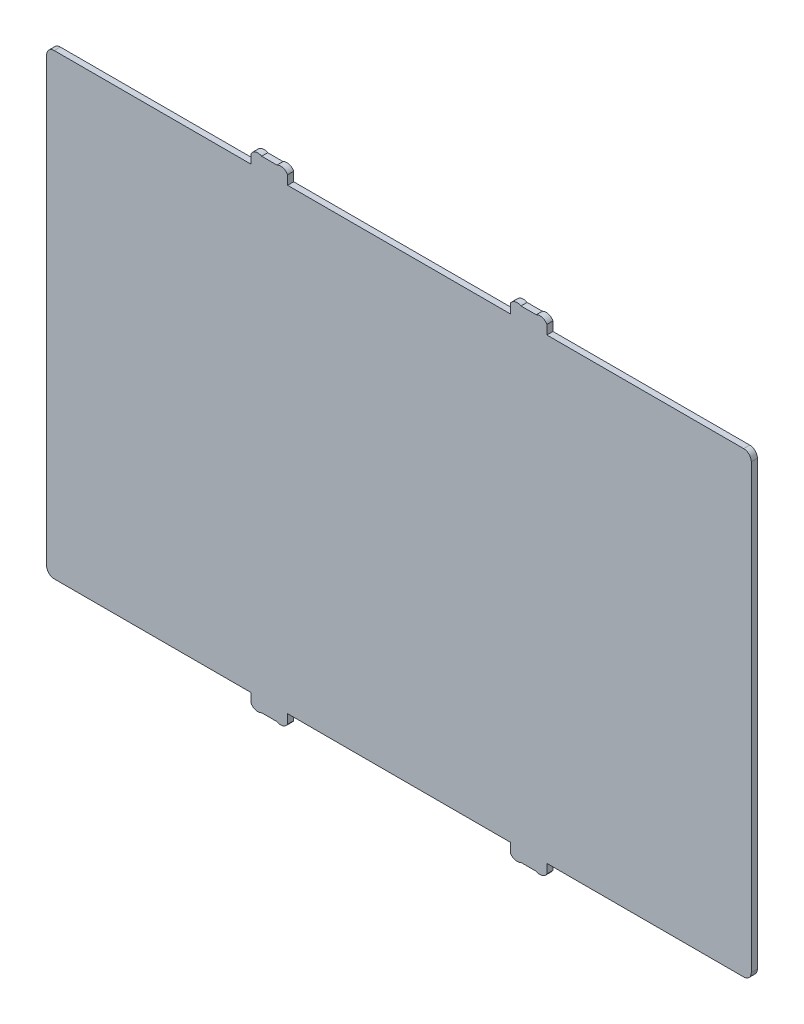
ISO-10303-21;
HEADER;
FILE_DESCRIPTION(('STEP AP214'),'2;1');
FILE_NAME('part.step','',(''),(''),'','','');
FILE_SCHEMA(('AUTOMOTIVE_DESIGN { 1 0 10303 214 1 1 1 1 }'));
ENDSEC;
DATA;
#1=APPLICATION_CONTEXT('core data for automotive mechanical design processes');
#2=APPLICATION_PROTOCOL_DEFINITION('international standard','automotive_design',2000,#1);
#3=PRODUCT_CONTEXT('',#1,'mechanical');
#4=PRODUCT('Part','Part','',(#3));
#5=PRODUCT_RELATED_PRODUCT_CATEGORY('part','',(#4));
#6=PRODUCT_DEFINITION_FORMATION('','',#4);
#7=PRODUCT_DEFINITION_CONTEXT('part definition',#1,'design');
#8=PRODUCT_DEFINITION('design','',#6,#7);
#9=PRODUCT_DEFINITION_SHAPE('','',#8);
#10=(LENGTH_UNIT() NAMED_UNIT(*) SI_UNIT(.MILLI.,.METRE.));
#11=(NAMED_UNIT(*) PLANE_ANGLE_UNIT() SI_UNIT($,.RADIAN.));
#12=(NAMED_UNIT(*) SI_UNIT($,.STERADIAN.) SOLID_ANGLE_UNIT());
#13=UNCERTAINTY_MEASURE_WITH_UNIT(LENGTH_MEASURE(1.E-05),#10,'distance_accuracy_value','');
#14=(GEOMETRIC_REPRESENTATION_CONTEXT(3) GLOBAL_UNCERTAINTY_ASSIGNED_CONTEXT((#13)) GLOBAL_UNIT_ASSIGNED_CONTEXT((#10,
#11,#12)) REPRESENTATION_CONTEXT('',''));
#15=CARTESIAN_POINT('',(0.,0.,0.));
#16=DIRECTION('',(0.,0.,1.));
#17=DIRECTION('',(1.,0.,0.));
#18=AXIS2_PLACEMENT_3D('',#15,#16,#17);
#19=CARTESIAN_POINT('',(24.,-71.2866219057477,4.));
#20=DIRECTION('',(0.,0.,-1.));
#21=DIRECTION('',(-1.,0.,0.));
#22=AXIS2_PLACEMENT_3D('',#19,#20,#21);
#23=CYLINDRICAL_SURFACE('',#22,5.);
#24=CARTESIAN_POINT('',(24.,-71.2866219057477,0.));
#25=DIRECTION('',(0.,0.,1.));
#26=DIRECTION('',(1.,0.,0.));
#27=AXIS2_PLACEMENT_3D('',#24,#25,#26);
#28=CIRCLE('',#27,5.);
#29=CARTESIAN_POINT('',(24.,-66.2866219057477,0.));
#30=VERTEX_POINT('',#29);
#31=CARTESIAN_POINT('',(19.,-71.2866219057477,0.));
#32=VERTEX_POINT('',#31);
#33=EDGE_CURVE('E271',#30,#32,#28,.T.);
#34=ORIENTED_EDGE('',*,*,#33,.T.);
#35=DIRECTION('',(0.,0.,-1.));
#36=VECTOR('',#35,1.);
#37=CARTESIAN_POINT('',(19.,-71.2866219057477,4.));
#38=LINE('',#37,#36);
#39=CARTESIAN_POINT('',(19.,-71.2866219057477,4.));
#40=VERTEX_POINT('',#39);
#41=EDGE_CURVE('E11',#40,#32,#38,.T.);
#42=ORIENTED_EDGE('',*,*,#41,.F.);
#43=CARTESIAN_POINT('',(24.,-71.2866219057477,4.));
#44=DIRECTION('',(0.,0.,1.));
#45=DIRECTION('',(1.,0.,0.));
#46=AXIS2_PLACEMENT_3D('',#43,#44,#45);
#47=CIRCLE('',#46,5.);
#48=CARTESIAN_POINT('',(24.,-66.2866219057477,4.));
#49=VERTEX_POINT('',#48);
#50=EDGE_CURVE('E333',#49,#40,#47,.T.);
#51=ORIENTED_EDGE('',*,*,#50,.F.);
#52=DIRECTION('',(0.,0.,-1.));
#53=VECTOR('',#52,1.);
#54=CARTESIAN_POINT('',(24.,-66.2866219057477,4.));
#55=LINE('',#54,#53);
#56=EDGE_CURVE('E267',#49,#30,#55,.T.);
#57=ORIENTED_EDGE('',*,*,#56,.T.);
#58=EDGE_LOOP('',(#34,#42,#51,#57));
#59=FACE_BOUND('',#58,.T.);
#60=ADVANCED_FACE('F31',(#59),#23,.T.);
#61=CARTESIAN_POINT('',(19.,-71.2866219057477,4.));
#62=DIRECTION('',(1.,0.,0.));
#63=DIRECTION('',(0.,1.,0.));
#64=AXIS2_PLACEMENT_3D('',#61,#62,#63);
#65=PLANE('',#64);
#66=DIRECTION('',(0.,-1.,0.));
#67=VECTOR('',#66,1.);
#68=CARTESIAN_POINT('',(19.,-71.2866219057477,0.));
#69=LINE('',#68,#67);
#70=CARTESIAN_POINT('',(19.,-361.286621905748,0.));
#71=VERTEX_POINT('',#70);
#72=EDGE_CURVE('E274',#32,#71,#69,.T.);
#73=ORIENTED_EDGE('',*,*,#72,.T.);
#74=DIRECTION('',(0.,0.,-1.));
#75=VECTOR('',#74,1.);
#76=CARTESIAN_POINT('',(19.,-361.286621905748,4.));
#77=LINE('',#76,#75);
#78=CARTESIAN_POINT('',(19.,-361.286621905748,4.));
#79=VERTEX_POINT('',#78);
#80=EDGE_CURVE('E39',#79,#71,#77,.T.);
#81=ORIENTED_EDGE('',*,*,#80,.F.);
#82=DIRECTION('',(0.,-1.,0.));
#83=VECTOR('',#82,1.);
#84=CARTESIAN_POINT('',(19.,-71.2866219057477,4.));
#85=LINE('',#84,#83);
#86=EDGE_CURVE('E162',#40,#79,#85,.T.);
#87=ORIENTED_EDGE('',*,*,#86,.F.);
#88=ORIENTED_EDGE('',*,*,#41,.T.);
#89=EDGE_LOOP('',(#73,#81,#87,#88));
#90=FACE_BOUND('',#89,.T.);
#91=ADVANCED_FACE('F511',(#90),#65,.F.);
#92=CARTESIAN_POINT('',(24.,-361.286621905748,4.));
#93=DIRECTION('',(0.,0.,-1.));
#94=DIRECTION('',(-1.,0.,0.));
#95=AXIS2_PLACEMENT_3D('',#92,#93,#94);
#96=CYLINDRICAL_SURFACE('',#95,5.);
#97=CARTESIAN_POINT('',(24.,-361.286621905748,0.));
#98=DIRECTION('',(0.,0.,1.));
#99=DIRECTION('',(1.,0.,0.));
#100=AXIS2_PLACEMENT_3D('',#97,#98,#99);
#101=CIRCLE('',#100,5.);
#102=CARTESIAN_POINT('',(24.0000000000001,-366.286621905748,0.));
#103=VERTEX_POINT('',#102);
#104=EDGE_CURVE('E276',#71,#103,#101,.T.);
#105=ORIENTED_EDGE('',*,*,#104,.T.);
#106=DIRECTION('',(0.,0.,-1.));
#107=VECTOR('',#106,1.);
#108=CARTESIAN_POINT('',(24.0000000000001,-366.286621905748,4.));
#109=LINE('',#108,#107);
#110=CARTESIAN_POINT('',(24.0000000000001,-366.286621905748,4.));
#111=VERTEX_POINT('',#110);
#112=EDGE_CURVE('E412',#111,#103,#109,.T.);
#113=ORIENTED_EDGE('',*,*,#112,.F.);
#114=CARTESIAN_POINT('',(24.,-361.286621905748,4.));
#115=DIRECTION('',(0.,0.,1.));
#116=DIRECTION('',(1.,0.,0.));
#117=AXIS2_PLACEMENT_3D('',#114,#115,#116);
#118=CIRCLE('',#117,5.);
#119=EDGE_CURVE('E420',#79,#111,#118,.T.);
#120=ORIENTED_EDGE('',*,*,#119,.F.);
#121=ORIENTED_EDGE('',*,*,#80,.T.);
#122=EDGE_LOOP('',(#105,#113,#120,#121));
#123=FACE_BOUND('',#122,.T.);
#124=ADVANCED_FACE('F418',(#123),#96,.T.);
#125=CARTESIAN_POINT('',(24.0000000000001,-366.286621905748,4.));
#126=DIRECTION('',(0.,1.,0.));
#127=DIRECTION('',(0.,0.,1.));
#128=AXIS2_PLACEMENT_3D('',#125,#126,#127);
#129=PLANE('',#128);
#130=DIRECTION('',(1.,0.,0.));
#131=VECTOR('',#130,1.);
#132=CARTESIAN_POINT('',(24.0000000000001,-366.286621905748,0.));
#133=LINE('',#132,#131);
#134=CARTESIAN_POINT('',(153.,-366.286621905748,0.));
#135=VERTEX_POINT('',#134);
#136=EDGE_CURVE('E278',#103,#135,#133,.T.);
#137=ORIENTED_EDGE('',*,*,#136,.T.);
#138=DIRECTION('',(0.,0.,-1.));
#139=VECTOR('',#138,1.);
#140=CARTESIAN_POINT('',(153.,-366.286621905748,4.));
#141=LINE('',#140,#139);
#142=CARTESIAN_POINT('',(153.,-366.286621905748,4.));
#143=VERTEX_POINT('',#142);
#144=EDGE_CURVE('E409',#143,#135,#141,.T.);
#145=ORIENTED_EDGE('',*,*,#144,.F.);
#146=DIRECTION('',(1.,0.,0.));
#147=VECTOR('',#146,1.);
#148=CARTESIAN_POINT('',(24.0000000000001,-366.286621905748,4.));
#149=LINE('',#148,#147);
#150=EDGE_CURVE('E438',#111,#143,#149,.T.);
#151=ORIENTED_EDGE('',*,*,#150,.F.);
#152=ORIENTED_EDGE('',*,*,#112,.T.);
#153=EDGE_LOOP('',(#137,#145,#151,#152));
#154=FACE_BOUND('',#153,.T.);
#155=ADVANCED_FACE('F429',(#154),#129,.F.);
#156=CARTESIAN_POINT('',(153.,-366.286621905748,4.));
#157=DIRECTION('',(1.,0.,0.));
#158=DIRECTION('',(0.,0.,-1.));
#159=AXIS2_PLACEMENT_3D('',#156,#157,#158);
#160=PLANE('',#159);
#161=DIRECTION('',(0.,-1.,0.));
#162=VECTOR('',#161,1.);
#163=CARTESIAN_POINT('',(153.,-366.286621905748,0.));
#164=LINE('',#163,#162);
#165=CARTESIAN_POINT('',(153.,-372.286621905748,0.));
#166=VERTEX_POINT('',#165);
#167=EDGE_CURVE('E280',#135,#166,#164,.T.);
#168=ORIENTED_EDGE('',*,*,#167,.T.);
#169=DIRECTION('',(0.,0.,-1.));
#170=VECTOR('',#169,1.);
#171=CARTESIAN_POINT('',(153.,-372.286621905748,4.));
#172=LINE('',#171,#170);
#173=CARTESIAN_POINT('',(153.,-372.286621905748,4.));
#174=VERTEX_POINT('',#173);
#175=EDGE_CURVE('E406',#174,#166,#172,.T.);
#176=ORIENTED_EDGE('',*,*,#175,.F.);
#177=DIRECTION('',(0.,-1.,0.));
#178=VECTOR('',#177,1.);
#179=CARTESIAN_POINT('',(153.,-366.286621905748,4.));
#180=LINE('',#179,#178);
#181=EDGE_CURVE('E435',#143,#174,#180,.T.);
#182=ORIENTED_EDGE('',*,*,#181,.F.);
#183=ORIENTED_EDGE('',*,*,#144,.T.);
#184=EDGE_LOOP('',(#168,#176,#182,#183));
#185=FACE_BOUND('',#184,.T.);
#186=ADVANCED_FACE('F433',(#185),#160,.F.);
#187=CARTESIAN_POINT('',(157.5,-369.786621905748,4.));
#188=DIRECTION('',(0.,0.,-1.));
#189=DIRECTION('',(-1.,0.,0.));
#190=AXIS2_PLACEMENT_3D('',#187,#188,#189);
#191=CYLINDRICAL_SURFACE('',#190,5.14781507049347);
#192=CARTESIAN_POINT('',(157.5,-369.786621905748,0.));
#193=DIRECTION('',(0.,0.,1.));
#194=DIRECTION('',(1.,0.,0.));
#195=AXIS2_PLACEMENT_3D('',#192,#193,#194);
#196=CIRCLE('',#195,5.14781507049347);
#197=CARTESIAN_POINT('',(160.,-374.286621905748,0.));
#198=VERTEX_POINT('',#197);
#199=EDGE_CURVE('E282',#166,#198,#196,.T.);
#200=ORIENTED_EDGE('',*,*,#199,.T.);
#201=DIRECTION('',(0.,0.,-1.));
#202=VECTOR('',#201,1.);
#203=CARTESIAN_POINT('',(160.,-374.286621905748,4.));
#204=LINE('',#203,#202);
#205=CARTESIAN_POINT('',(160.,-374.286621905748,4.));
#206=VERTEX_POINT('',#205);
#207=EDGE_CURVE('E403',#206,#198,#204,.T.);
#208=ORIENTED_EDGE('',*,*,#207,.F.);
#209=CARTESIAN_POINT('',(157.5,-369.786621905748,4.));
#210=DIRECTION('',(0.,0.,1.));
#211=DIRECTION('',(1.,0.,0.));
#212=AXIS2_PLACEMENT_3D('',#209,#210,#211);
#213=CIRCLE('',#212,5.14781507049347);
#214=EDGE_CURVE('E437',#174,#206,#213,.T.);
#215=ORIENTED_EDGE('',*,*,#214,.F.);
#216=ORIENTED_EDGE('',*,*,#175,.T.);
#217=EDGE_LOOP('',(#200,#208,#215,#216));
#218=FACE_BOUND('',#217,.T.);
#219=ADVANCED_FACE('F524',(#218),#191,.T.);
#220=CARTESIAN_POINT('',(160.,-374.286621905748,4.));
#221=DIRECTION('',(0.,1.,0.));
#222=DIRECTION('',(0.,0.,1.));
#223=AXIS2_PLACEMENT_3D('',#220,#221,#222);
#224=PLANE('',#223);
#225=DIRECTION('',(1.,0.,0.));
#226=VECTOR('',#225,1.);
#227=CARTESIAN_POINT('',(160.,-374.286621905748,0.));
#228=LINE('',#227,#226);
#229=CARTESIAN_POINT('',(170.,-374.286621905748,0.));
#230=VERTEX_POINT('',#229);
#231=EDGE_CURVE('E284',#198,#230,#228,.T.);
#232=ORIENTED_EDGE('',*,*,#231,.T.);
#233=DIRECTION('',(0.,0.,-1.));
#234=VECTOR('',#233,1.);
#235=CARTESIAN_POINT('',(170.,-374.286621905748,4.));
#236=LINE('',#235,#234);
#237=CARTESIAN_POINT('',(170.,-374.286621905748,4.));
#238=VERTEX_POINT('',#237);
#239=EDGE_CURVE('E400',#238,#230,#236,.T.);
#240=ORIENTED_EDGE('',*,*,#239,.F.);
#241=DIRECTION('',(1.,0.,0.));
#242=VECTOR('',#241,1.);
#243=CARTESIAN_POINT('',(160.,-374.286621905748,4.));
#244=LINE('',#243,#242);
#245=EDGE_CURVE('E440',#206,#238,#244,.T.);
#246=ORIENTED_EDGE('',*,*,#245,.F.);
#247=ORIENTED_EDGE('',*,*,#207,.T.);
#248=EDGE_LOOP('',(#232,#240,#246,#247));
#249=FACE_BOUND('',#248,.T.);
#250=ADVANCED_FACE('F527',(#249),#224,.F.);
#251=CARTESIAN_POINT('',(172.5,-369.786621905748,4.));
#252=DIRECTION('',(0.,0.,-1.));
#253=DIRECTION('',(-1.,0.,0.));
#254=AXIS2_PLACEMENT_3D('',#251,#252,#253);
#255=CYLINDRICAL_SURFACE('',#254,5.14781507049354);
#256=CARTESIAN_POINT('',(172.5,-369.786621905748,0.));
#257=DIRECTION('',(0.,0.,1.));
#258=DIRECTION('',(1.,0.,0.));
#259=AXIS2_PLACEMENT_3D('',#256,#257,#258);
#260=CIRCLE('',#259,5.14781507049354);
#261=CARTESIAN_POINT('',(177.,-372.286621905748,0.));
#262=VERTEX_POINT('',#261);
#263=EDGE_CURVE('E286',#230,#262,#260,.T.);
#264=ORIENTED_EDGE('',*,*,#263,.T.);
#265=DIRECTION('',(0.,0.,-1.));
#266=VECTOR('',#265,1.);
#267=CARTESIAN_POINT('',(177.,-372.286621905748,4.));
#268=LINE('',#267,#266);
#269=CARTESIAN_POINT('',(177.,-372.286621905748,4.));
#270=VERTEX_POINT('',#269);
#271=EDGE_CURVE('E397',#270,#262,#268,.T.);
#272=ORIENTED_EDGE('',*,*,#271,.F.);
#273=CARTESIAN_POINT('',(172.5,-369.786621905748,4.));
#274=DIRECTION('',(0.,0.,1.));
#275=DIRECTION('',(1.,0.,0.));
#276=AXIS2_PLACEMENT_3D('',#273,#274,#275);
#277=CIRCLE('',#276,5.14781507049354);
#278=EDGE_CURVE('E446',#238,#270,#277,.T.);
#279=ORIENTED_EDGE('',*,*,#278,.F.);
#280=ORIENTED_EDGE('',*,*,#239,.T.);
#281=EDGE_LOOP('',(#264,#272,#279,#280));
#282=FACE_BOUND('',#281,.T.);
#283=ADVANCED_FACE('F531',(#282),#255,.T.);
#284=CARTESIAN_POINT('',(177.,-366.286621905748,4.));
#285=DIRECTION('',(-1.,0.,0.));
#286=DIRECTION('',(0.,0.,1.));
#287=AXIS2_PLACEMENT_3D('',#284,#285,#286);
#288=PLANE('',#287);
#289=DIRECTION('',(0.,1.,0.));
#290=VECTOR('',#289,1.);
#291=CARTESIAN_POINT('',(177.,-366.286621905748,0.));
#292=LINE('',#291,#290);
#293=CARTESIAN_POINT('',(177.,-366.286621905748,0.));
#294=VERTEX_POINT('',#293);
#295=EDGE_CURVE('E288',#262,#294,#292,.T.);
#296=ORIENTED_EDGE('',*,*,#295,.T.);
#297=DIRECTION('',(0.,0.,-1.));
#298=VECTOR('',#297,1.);
#299=CARTESIAN_POINT('',(177.,-366.286621905748,4.));
#300=LINE('',#299,#298);
#301=CARTESIAN_POINT('',(177.,-366.286621905748,4.));
#302=VERTEX_POINT('',#301);
#303=EDGE_CURVE('E394',#302,#294,#300,.T.);
#304=ORIENTED_EDGE('',*,*,#303,.F.);
#305=DIRECTION('',(0.,1.,0.));
#306=VECTOR('',#305,1.);
#307=CARTESIAN_POINT('',(177.,-366.286621905748,4.));
#308=LINE('',#307,#306);
#309=EDGE_CURVE('E448',#270,#302,#308,.T.);
#310=ORIENTED_EDGE('',*,*,#309,.F.);
#311=ORIENTED_EDGE('',*,*,#271,.T.);
#312=EDGE_LOOP('',(#296,#304,#310,#311));
#313=FACE_BOUND('',#312,.T.);
#314=ADVANCED_FACE('F535',(#313),#288,.F.);
#315=CARTESIAN_POINT('',(323.,-366.286621905748,4.));
#316=DIRECTION('',(0.,1.,0.));
#317=DIRECTION('',(0.,0.,1.));
#318=AXIS2_PLACEMENT_3D('',#315,#316,#317);
#319=PLANE('',#318);
#320=DIRECTION('',(1.,0.,0.));
#321=VECTOR('',#320,1.);
#322=CARTESIAN_POINT('',(323.,-366.286621905748,0.));
#323=LINE('',#322,#321);
#324=CARTESIAN_POINT('',(323.,-366.286621905748,0.));
#325=VERTEX_POINT('',#324);
#326=EDGE_CURVE('E290',#294,#325,#323,.T.);
#327=ORIENTED_EDGE('',*,*,#326,.T.);
#328=DIRECTION('',(0.,0.,-1.));
#329=VECTOR('',#328,1.);
#330=CARTESIAN_POINT('',(323.,-366.286621905748,4.));
#331=LINE('',#330,#329);
#332=CARTESIAN_POINT('',(323.,-366.286621905748,4.));
#333=VERTEX_POINT('',#332);
#334=EDGE_CURVE('E391',#333,#325,#331,.T.);
#335=ORIENTED_EDGE('',*,*,#334,.F.);
#336=DIRECTION('',(1.,0.,0.));
#337=VECTOR('',#336,1.);
#338=CARTESIAN_POINT('',(323.,-366.286621905748,4.));
#339=LINE('',#338,#337);
#340=EDGE_CURVE('E450',#302,#333,#339,.T.);
#341=ORIENTED_EDGE('',*,*,#340,.F.);
#342=ORIENTED_EDGE('',*,*,#303,.T.);
#343=EDGE_LOOP('',(#327,#335,#341,#342));
#344=FACE_BOUND('',#343,.T.);
#345=ADVANCED_FACE('F539',(#344),#319,.F.);
#346=CARTESIAN_POINT('',(323.,-366.286621905748,4.));
#347=DIRECTION('',(1.,0.,0.));
#348=DIRECTION('',(0.,0.,-1.));
#349=AXIS2_PLACEMENT_3D('',#346,#347,#348);
#350=PLANE('',#349);
#351=DIRECTION('',(0.,-1.,0.));
#352=VECTOR('',#351,1.);
#353=CARTESIAN_POINT('',(323.,-366.286621905748,0.));
#354=LINE('',#353,#352);
#355=CARTESIAN_POINT('',(323.,-372.286621905748,0.));
#356=VERTEX_POINT('',#355);
#357=EDGE_CURVE('E292',#325,#356,#354,.T.);
#358=ORIENTED_EDGE('',*,*,#357,.T.);
#359=DIRECTION('',(0.,0.,-1.));
#360=VECTOR('',#359,1.);
#361=CARTESIAN_POINT('',(323.,-372.286621905748,4.));
#362=LINE('',#361,#360);
#363=CARTESIAN_POINT('',(323.,-372.286621905748,4.));
#364=VERTEX_POINT('',#363);
#365=EDGE_CURVE('E388',#364,#356,#362,.T.);
#366=ORIENTED_EDGE('',*,*,#365,.F.);
#367=DIRECTION('',(0.,-1.,0.));
#368=VECTOR('',#367,1.);
#369=CARTESIAN_POINT('',(323.,-366.286621905748,4.));
#370=LINE('',#369,#368);
#371=EDGE_CURVE('E452',#333,#364,#370,.T.);
#372=ORIENTED_EDGE('',*,*,#371,.F.);
#373=ORIENTED_EDGE('',*,*,#334,.T.);
#374=EDGE_LOOP('',(#358,#366,#372,#373));
#375=FACE_BOUND('',#374,.T.);
#376=ADVANCED_FACE('F543',(#375),#350,.F.);
#377=CARTESIAN_POINT('',(327.5,-369.786621905748,4.));
#378=DIRECTION('',(0.,0.,-1.));
#379=DIRECTION('',(-1.,0.,0.));
#380=AXIS2_PLACEMENT_3D('',#377,#378,#379);
#381=CYLINDRICAL_SURFACE('',#380,5.14781507049354);
#382=CARTESIAN_POINT('',(327.5,-369.786621905748,0.));
#383=DIRECTION('',(0.,0.,1.));
#384=DIRECTION('',(-1.,0.,0.));
#385=AXIS2_PLACEMENT_3D('',#382,#383,#384);
#386=CIRCLE('',#385,5.14781507049354);
#387=CARTESIAN_POINT('',(330.,-374.286621905748,0.));
#388=VERTEX_POINT('',#387);
#389=EDGE_CURVE('E294',#356,#388,#386,.T.);
#390=ORIENTED_EDGE('',*,*,#389,.T.);
#391=DIRECTION('',(0.,0.,-1.));
#392=VECTOR('',#391,1.);
#393=CARTESIAN_POINT('',(330.,-374.286621905748,4.));
#394=LINE('',#393,#392);
#395=CARTESIAN_POINT('',(330.,-374.286621905748,4.));
#396=VERTEX_POINT('',#395);
#397=EDGE_CURVE('E385',#396,#388,#394,.T.);
#398=ORIENTED_EDGE('',*,*,#397,.F.);
#399=CARTESIAN_POINT('',(327.5,-369.786621905748,4.));
#400=DIRECTION('',(0.,0.,1.));
#401=DIRECTION('',(-1.,0.,0.));
#402=AXIS2_PLACEMENT_3D('',#399,#400,#401);
#403=CIRCLE('',#402,5.14781507049354);
#404=EDGE_CURVE('E454',#364,#396,#403,.T.);
#405=ORIENTED_EDGE('',*,*,#404,.F.);
#406=ORIENTED_EDGE('',*,*,#365,.T.);
#407=EDGE_LOOP('',(#390,#398,#405,#406));
#408=FACE_BOUND('',#407,.T.);
#409=ADVANCED_FACE('F547',(#408),#381,.T.);
#410=CARTESIAN_POINT('',(330.,-374.286621905748,4.));
#411=DIRECTION('',(0.,1.,0.));
#412=DIRECTION('',(0.,0.,1.));
#413=AXIS2_PLACEMENT_3D('',#410,#411,#412);
#414=PLANE('',#413);
#415=DIRECTION('',(1.,0.,0.));
#416=VECTOR('',#415,1.);
#417=CARTESIAN_POINT('',(330.,-374.286621905748,0.));
#418=LINE('',#417,#416);
#419=CARTESIAN_POINT('',(340.,-374.286621905748,0.));
#420=VERTEX_POINT('',#419);
#421=EDGE_CURVE('E296',#388,#420,#418,.T.);
#422=ORIENTED_EDGE('',*,*,#421,.T.);
#423=DIRECTION('',(0.,0.,-1.));
#424=VECTOR('',#423,1.);
#425=CARTESIAN_POINT('',(340.,-374.286621905748,4.));
#426=LINE('',#425,#424);
#427=CARTESIAN_POINT('',(340.,-374.286621905748,4.));
#428=VERTEX_POINT('',#427);
#429=EDGE_CURVE('E382',#428,#420,#426,.T.);
#430=ORIENTED_EDGE('',*,*,#429,.F.);
#431=DIRECTION('',(1.,0.,0.));
#432=VECTOR('',#431,1.);
#433=CARTESIAN_POINT('',(330.,-374.286621905748,4.));
#434=LINE('',#433,#432);
#435=EDGE_CURVE('E456',#396,#428,#434,.T.);
#436=ORIENTED_EDGE('',*,*,#435,.F.);
#437=ORIENTED_EDGE('',*,*,#397,.T.);
#438=EDGE_LOOP('',(#422,#430,#436,#437));
#439=FACE_BOUND('',#438,.T.);
#440=ADVANCED_FACE('F551',(#439),#414,.F.);
#441=CARTESIAN_POINT('',(342.5,-369.786621905748,4.));
#442=DIRECTION('',(0.,0.,-1.));
#443=DIRECTION('',(-1.,0.,0.));
#444=AXIS2_PLACEMENT_3D('',#441,#442,#443);
#445=CYLINDRICAL_SURFACE('',#444,5.14781507049342);
#446=CARTESIAN_POINT('',(342.5,-369.786621905748,0.));
#447=DIRECTION('',(0.,0.,1.));
#448=DIRECTION('',(-1.,0.,0.));
#449=AXIS2_PLACEMENT_3D('',#446,#447,#448);
#450=CIRCLE('',#449,5.14781507049342);
#451=CARTESIAN_POINT('',(347.,-372.286621905748,0.));
#452=VERTEX_POINT('',#451);
#453=EDGE_CURVE('E298',#420,#452,#450,.T.);
#454=ORIENTED_EDGE('',*,*,#453,.T.);
#455=DIRECTION('',(0.,0.,-1.));
#456=VECTOR('',#455,1.);
#457=CARTESIAN_POINT('',(347.,-372.286621905748,4.));
#458=LINE('',#457,#456);
#459=CARTESIAN_POINT('',(347.,-372.286621905748,4.));
#460=VERTEX_POINT('',#459);
#461=EDGE_CURVE('E379',#460,#452,#458,.T.);
#462=ORIENTED_EDGE('',*,*,#461,.F.);
#463=CARTESIAN_POINT('',(342.5,-369.786621905748,4.));
#464=DIRECTION('',(0.,0.,1.));
#465=DIRECTION('',(-1.,0.,0.));
#466=AXIS2_PLACEMENT_3D('',#463,#464,#465);
#467=CIRCLE('',#466,5.14781507049342);
#468=EDGE_CURVE('E458',#428,#460,#467,.T.);
#469=ORIENTED_EDGE('',*,*,#468,.F.);
#470=ORIENTED_EDGE('',*,*,#429,.T.);
#471=EDGE_LOOP('',(#454,#462,#469,#470));
#472=FACE_BOUND('',#471,.T.);
#473=ADVANCED_FACE('F555',(#472),#445,.T.);
#474=CARTESIAN_POINT('',(347.,-366.286621905748,4.));
#475=DIRECTION('',(-1.,0.,0.));
#476=DIRECTION('',(0.,0.,1.));
#477=AXIS2_PLACEMENT_3D('',#474,#475,#476);
#478=PLANE('',#477);
#479=DIRECTION('',(0.,1.,0.));
#480=VECTOR('',#479,1.);
#481=CARTESIAN_POINT('',(347.,-366.286621905748,0.));
#482=LINE('',#481,#480);
#483=CARTESIAN_POINT('',(347.,-366.286621905748,0.));
#484=VERTEX_POINT('',#483);
#485=EDGE_CURVE('E300',#452,#484,#482,.T.);
#486=ORIENTED_EDGE('',*,*,#485,.T.);
#487=DIRECTION('',(0.,0.,-1.));
#488=VECTOR('',#487,1.);
#489=CARTESIAN_POINT('',(347.,-366.286621905748,4.));
#490=LINE('',#489,#488);
#491=CARTESIAN_POINT('',(347.,-366.286621905748,4.));
#492=VERTEX_POINT('',#491);
#493=EDGE_CURVE('E376',#492,#484,#490,.T.);
#494=ORIENTED_EDGE('',*,*,#493,.F.);
#495=DIRECTION('',(0.,1.,0.));
#496=VECTOR('',#495,1.);
#497=CARTESIAN_POINT('',(347.,-366.286621905748,4.));
#498=LINE('',#497,#496);
#499=EDGE_CURVE('E460',#460,#492,#498,.T.);
#500=ORIENTED_EDGE('',*,*,#499,.F.);
#501=ORIENTED_EDGE('',*,*,#461,.T.);
#502=EDGE_LOOP('',(#486,#494,#500,#501));
#503=FACE_BOUND('',#502,.T.);
#504=ADVANCED_FACE('F559',(#503),#478,.F.);
#505=CARTESIAN_POINT('',(347.,-366.286621905748,4.));
#506=DIRECTION('',(0.,1.,0.));
#507=DIRECTION('',(0.,0.,1.));
#508=AXIS2_PLACEMENT_3D('',#505,#506,#507);
#509=PLANE('',#508);
#510=DIRECTION('',(1.,0.,0.));
#511=VECTOR('',#510,1.);
#512=CARTESIAN_POINT('',(347.,-366.286621905748,0.));
#513=LINE('',#512,#511);
#514=CARTESIAN_POINT('',(476.,-366.286621905748,0.));
#515=VERTEX_POINT('',#514);
#516=EDGE_CURVE('E302',#484,#515,#513,.T.);
#517=ORIENTED_EDGE('',*,*,#516,.T.);
#518=DIRECTION('',(0.,0.,-1.));
#519=VECTOR('',#518,1.);
#520=CARTESIAN_POINT('',(476.,-366.286621905748,4.));
#521=LINE('',#520,#519);
#522=CARTESIAN_POINT('',(476.,-366.286621905748,4.));
#523=VERTEX_POINT('',#522);
#524=EDGE_CURVE('E373',#523,#515,#521,.T.);
#525=ORIENTED_EDGE('',*,*,#524,.F.);
#526=DIRECTION('',(1.,0.,0.));
#527=VECTOR('',#526,1.);
#528=CARTESIAN_POINT('',(347.,-366.286621905748,4.));
#529=LINE('',#528,#527);
#530=EDGE_CURVE('E462',#492,#523,#529,.T.);
#531=ORIENTED_EDGE('',*,*,#530,.F.);
#532=ORIENTED_EDGE('',*,*,#493,.T.);
#533=EDGE_LOOP('',(#517,#525,#531,#532));
#534=FACE_BOUND('',#533,.T.);
#535=ADVANCED_FACE('F563',(#534),#509,.F.);
#536=CARTESIAN_POINT('',(476.,-361.286621905748,4.));
#537=DIRECTION('',(0.,0.,-1.));
#538=DIRECTION('',(-1.,0.,0.));
#539=AXIS2_PLACEMENT_3D('',#536,#537,#538);
#540=CYLINDRICAL_SURFACE('',#539,5.);
#541=CARTESIAN_POINT('',(476.,-361.286621905748,0.));
#542=DIRECTION('',(0.,0.,1.));
#543=DIRECTION('',(-1.,0.,0.));
#544=AXIS2_PLACEMENT_3D('',#541,#542,#543);
#545=CIRCLE('',#544,5.);
#546=CARTESIAN_POINT('',(481.,-361.286621905748,0.));
#547=VERTEX_POINT('',#546);
#548=EDGE_CURVE('E304',#515,#547,#545,.T.);
#549=ORIENTED_EDGE('',*,*,#548,.T.);
#550=DIRECTION('',(0.,0.,-1.));
#551=VECTOR('',#550,1.);
#552=CARTESIAN_POINT('',(481.,-361.286621905748,4.));
#553=LINE('',#552,#551);
#554=CARTESIAN_POINT('',(481.,-361.286621905748,4.));
#555=VERTEX_POINT('',#554);
#556=EDGE_CURVE('E370',#555,#547,#553,.T.);
#557=ORIENTED_EDGE('',*,*,#556,.F.);
#558=CARTESIAN_POINT('',(476.,-361.286621905748,4.));
#559=DIRECTION('',(0.,0.,1.));
#560=DIRECTION('',(-1.,0.,0.));
#561=AXIS2_PLACEMENT_3D('',#558,#559,#560);
#562=CIRCLE('',#561,5.);
#563=EDGE_CURVE('E464',#523,#555,#562,.T.);
#564=ORIENTED_EDGE('',*,*,#563,.F.);
#565=ORIENTED_EDGE('',*,*,#524,.T.);
#566=EDGE_LOOP('',(#549,#557,#564,#565));
#567=FACE_BOUND('',#566,.T.);
#568=ADVANCED_FACE('F567',(#567),#540,.T.);
#569=CARTESIAN_POINT('',(481.,-71.2866219057477,4.));
#570=DIRECTION('',(-1.,0.,0.));
#571=DIRECTION('',(0.,0.,1.));
#572=AXIS2_PLACEMENT_3D('',#569,#570,#571);
#573=PLANE('',#572);
#574=DIRECTION('',(0.,1.,0.));
#575=VECTOR('',#574,1.);
#576=CARTESIAN_POINT('',(481.,-71.2866219057477,0.));
#577=LINE('',#576,#575);
#578=CARTESIAN_POINT('',(481.,-71.2866219057477,0.));
#579=VERTEX_POINT('',#578);
#580=EDGE_CURVE('E306',#547,#579,#577,.T.);
#581=ORIENTED_EDGE('',*,*,#580,.T.);
#582=DIRECTION('',(0.,0.,-1.));
#583=VECTOR('',#582,1.);
#584=CARTESIAN_POINT('',(481.,-71.2866219057477,4.));
#585=LINE('',#584,#583);
#586=CARTESIAN_POINT('',(481.,-71.2866219057477,4.));
#587=VERTEX_POINT('',#586);
#588=EDGE_CURVE('E367',#587,#579,#585,.T.);
#589=ORIENTED_EDGE('',*,*,#588,.F.);
#590=DIRECTION('',(0.,1.,0.));
#591=VECTOR('',#590,1.);
#592=CARTESIAN_POINT('',(481.,-71.2866219057477,4.));
#593=LINE('',#592,#591);
#594=EDGE_CURVE('E466',#555,#587,#593,.T.);
#595=ORIENTED_EDGE('',*,*,#594,.F.);
#596=ORIENTED_EDGE('',*,*,#556,.T.);
#597=EDGE_LOOP('',(#581,#589,#595,#596));
#598=FACE_BOUND('',#597,.T.);
#599=ADVANCED_FACE('F571',(#598),#573,.F.);
#600=CARTESIAN_POINT('',(476.,-71.2866219057477,4.));
#601=DIRECTION('',(0.,0.,-1.));
#602=DIRECTION('',(-1.,0.,0.));
#603=AXIS2_PLACEMENT_3D('',#600,#601,#602);
#604=CYLINDRICAL_SURFACE('',#603,5.);
#605=CARTESIAN_POINT('',(476.,-71.2866219057477,0.));
#606=DIRECTION('',(0.,0.,1.));
#607=DIRECTION('',(1.,0.,0.));
#608=AXIS2_PLACEMENT_3D('',#605,#606,#607);
#609=CIRCLE('',#608,5.);
#610=CARTESIAN_POINT('',(476.,-66.2866219057477,0.));
#611=VERTEX_POINT('',#610);
#612=EDGE_CURVE('E308',#579,#611,#609,.T.);
#613=ORIENTED_EDGE('',*,*,#612,.T.);
#614=DIRECTION('',(0.,0.,-1.));
#615=VECTOR('',#614,1.);
#616=CARTESIAN_POINT('',(476.,-66.2866219057477,4.));
#617=LINE('',#616,#615);
#618=CARTESIAN_POINT('',(476.,-66.2866219057477,4.));
#619=VERTEX_POINT('',#618);
#620=EDGE_CURVE('E364',#619,#611,#617,.T.);
#621=ORIENTED_EDGE('',*,*,#620,.F.);
#622=CARTESIAN_POINT('',(476.,-71.2866219057477,4.));
#623=DIRECTION('',(0.,0.,1.));
#624=DIRECTION('',(1.,0.,0.));
#625=AXIS2_PLACEMENT_3D('',#622,#623,#624);
#626=CIRCLE('',#625,5.);
#627=EDGE_CURVE('E468',#587,#619,#626,.T.);
#628=ORIENTED_EDGE('',*,*,#627,.F.);
#629=ORIENTED_EDGE('',*,*,#588,.T.);
#630=EDGE_LOOP('',(#613,#621,#628,#629));
#631=FACE_BOUND('',#630,.T.);
#632=ADVANCED_FACE('F575',(#631),#604,.T.);
#633=CARTESIAN_POINT('',(347.,-66.2866219057477,4.));
#634=DIRECTION('',(0.,-1.,0.));
#635=DIRECTION('',(0.,0.,-1.));
#636=AXIS2_PLACEMENT_3D('',#633,#634,#635);
#637=PLANE('',#636);
#638=DIRECTION('',(-1.,0.,0.));
#639=VECTOR('',#638,1.);
#640=CARTESIAN_POINT('',(347.,-66.2866219057477,0.));
#641=LINE('',#640,#639);
#642=CARTESIAN_POINT('',(347.,-66.2866219057477,0.));
#643=VERTEX_POINT('',#642);
#644=EDGE_CURVE('E310',#611,#643,#641,.T.);
#645=ORIENTED_EDGE('',*,*,#644,.T.);
#646=DIRECTION('',(0.,0.,-1.));
#647=VECTOR('',#646,1.);
#648=CARTESIAN_POINT('',(347.,-66.2866219057477,4.));
#649=LINE('',#648,#647);
#650=CARTESIAN_POINT('',(347.,-66.2866219057477,4.));
#651=VERTEX_POINT('',#650);
#652=EDGE_CURVE('E361',#651,#643,#649,.T.);
#653=ORIENTED_EDGE('',*,*,#652,.F.);
#654=DIRECTION('',(-1.,0.,0.));
#655=VECTOR('',#654,1.);
#656=CARTESIAN_POINT('',(347.,-66.2866219057477,4.));
#657=LINE('',#656,#655);
#658=EDGE_CURVE('E470',#619,#651,#657,.T.);
#659=ORIENTED_EDGE('',*,*,#658,.F.);
#660=ORIENTED_EDGE('',*,*,#620,.T.);
#661=EDGE_LOOP('',(#645,#653,#659,#660));
#662=FACE_BOUND('',#661,.T.);
#663=ADVANCED_FACE('F579',(#662),#637,.F.);
#664=CARTESIAN_POINT('',(347.,-60.2866219057477,4.));
#665=DIRECTION('',(-1.,0.,0.));
#666=DIRECTION('',(0.,0.,1.));
#667=AXIS2_PLACEMENT_3D('',#664,#665,#666);
#668=PLANE('',#667);
#669=DIRECTION('',(0.,1.,0.));
#670=VECTOR('',#669,1.);
#671=CARTESIAN_POINT('',(347.,-60.2866219057477,0.));
#672=LINE('',#671,#670);
#673=CARTESIAN_POINT('',(347.,-60.2866219057477,0.));
#674=VERTEX_POINT('',#673);
#675=EDGE_CURVE('E312',#643,#674,#672,.T.);
#676=ORIENTED_EDGE('',*,*,#675,.T.);
#677=DIRECTION('',(0.,0.,-1.));
#678=VECTOR('',#677,1.);
#679=CARTESIAN_POINT('',(347.,-60.2866219057477,4.));
#680=LINE('',#679,#678);
#681=CARTESIAN_POINT('',(347.,-60.2866219057477,4.));
#682=VERTEX_POINT('',#681);
#683=EDGE_CURVE('E358',#682,#674,#680,.T.);
#684=ORIENTED_EDGE('',*,*,#683,.F.);
#685=DIRECTION('',(0.,1.,0.));
#686=VECTOR('',#685,1.);
#687=CARTESIAN_POINT('',(347.,-60.2866219057477,4.));
#688=LINE('',#687,#686);
#689=EDGE_CURVE('E472',#651,#682,#688,.T.);
#690=ORIENTED_EDGE('',*,*,#689,.F.);
#691=ORIENTED_EDGE('',*,*,#652,.T.);
#692=EDGE_LOOP('',(#676,#684,#690,#691));
#693=FACE_BOUND('',#692,.T.);
#694=ADVANCED_FACE('F583',(#693),#668,.F.);
#695=CARTESIAN_POINT('',(342.5,-62.7866219057477,4.));
#696=DIRECTION('',(0.,0.,-1.));
#697=DIRECTION('',(-1.,0.,0.));
#698=AXIS2_PLACEMENT_3D('',#695,#696,#697);
#699=CYLINDRICAL_SURFACE('',#698,5.14781507049348);
#700=CARTESIAN_POINT('',(342.5,-62.7866219057477,0.));
#701=DIRECTION('',(0.,0.,1.));
#702=DIRECTION('',(1.,0.,0.));
#703=AXIS2_PLACEMENT_3D('',#700,#701,#702);
#704=CIRCLE('',#703,5.14781507049348);
#705=CARTESIAN_POINT('',(340.,-58.2866219057477,0.));
#706=VERTEX_POINT('',#705);
#707=EDGE_CURVE('E314',#674,#706,#704,.T.);
#708=ORIENTED_EDGE('',*,*,#707,.T.);
#709=DIRECTION('',(0.,0.,-1.));
#710=VECTOR('',#709,1.);
#711=CARTESIAN_POINT('',(340.,-58.2866219057477,4.));
#712=LINE('',#711,#710);
#713=CARTESIAN_POINT('',(340.,-58.2866219057477,4.));
#714=VERTEX_POINT('',#713);
#715=EDGE_CURVE('E355',#714,#706,#712,.T.);
#716=ORIENTED_EDGE('',*,*,#715,.F.);
#717=CARTESIAN_POINT('',(342.5,-62.7866219057477,4.));
#718=DIRECTION('',(0.,0.,1.));
#719=DIRECTION('',(1.,0.,0.));
#720=AXIS2_PLACEMENT_3D('',#717,#718,#719);
#721=CIRCLE('',#720,5.14781507049348);
#722=EDGE_CURVE('E474',#682,#714,#721,.T.);
#723=ORIENTED_EDGE('',*,*,#722,.F.);
#724=ORIENTED_EDGE('',*,*,#683,.T.);
#725=EDGE_LOOP('',(#708,#716,#723,#724));
#726=FACE_BOUND('',#725,.T.);
#727=ADVANCED_FACE('F587',(#726),#699,.T.);
#728=CARTESIAN_POINT('',(330.,-58.2866219057477,4.));
#729=DIRECTION('',(0.,-1.,0.));
#730=DIRECTION('',(0.,0.,-1.));
#731=AXIS2_PLACEMENT_3D('',#728,#729,#730);
#732=PLANE('',#731);
#733=DIRECTION('',(-1.,0.,0.));
#734=VECTOR('',#733,1.);
#735=CARTESIAN_POINT('',(330.,-58.2866219057477,0.));
#736=LINE('',#735,#734);
#737=CARTESIAN_POINT('',(330.,-58.2866219057477,0.));
#738=VERTEX_POINT('',#737);
#739=EDGE_CURVE('E316',#706,#738,#736,.T.);
#740=ORIENTED_EDGE('',*,*,#739,.T.);
#741=DIRECTION('',(0.,0.,-1.));
#742=VECTOR('',#741,1.);
#743=CARTESIAN_POINT('',(330.,-58.2866219057477,4.));
#744=LINE('',#743,#742);
#745=CARTESIAN_POINT('',(330.,-58.2866219057477,4.));
#746=VERTEX_POINT('',#745);
#747=EDGE_CURVE('E352',#746,#738,#744,.T.);
#748=ORIENTED_EDGE('',*,*,#747,.F.);
#749=DIRECTION('',(-1.,0.,0.));
#750=VECTOR('',#749,1.);
#751=CARTESIAN_POINT('',(330.,-58.2866219057477,4.));
#752=LINE('',#751,#750);
#753=EDGE_CURVE('E476',#714,#746,#752,.T.);
#754=ORIENTED_EDGE('',*,*,#753,.F.);
#755=ORIENTED_EDGE('',*,*,#715,.T.);
#756=EDGE_LOOP('',(#740,#748,#754,#755));
#757=FACE_BOUND('',#756,.T.);
#758=ADVANCED_FACE('F591',(#757),#732,.F.);
#759=CARTESIAN_POINT('',(327.5,-62.7866219057477,4.));
#760=DIRECTION('',(0.,0.,-1.));
#761=DIRECTION('',(-1.,0.,0.));
#762=AXIS2_PLACEMENT_3D('',#759,#760,#761);
#763=CYLINDRICAL_SURFACE('',#762,5.14781507049352);
#764=CARTESIAN_POINT('',(327.5,-62.7866219057477,0.));
#765=DIRECTION('',(0.,0.,1.));
#766=DIRECTION('',(-1.,0.,0.));
#767=AXIS2_PLACEMENT_3D('',#764,#765,#766);
#768=CIRCLE('',#767,5.14781507049352);
#769=CARTESIAN_POINT('',(323.,-60.2866219057477,0.));
#770=VERTEX_POINT('',#769);
#771=EDGE_CURVE('E318',#738,#770,#768,.T.);
#772=ORIENTED_EDGE('',*,*,#771,.T.);
#773=DIRECTION('',(0.,0.,-1.));
#774=VECTOR('',#773,1.);
#775=CARTESIAN_POINT('',(323.,-60.2866219057477,4.));
#776=LINE('',#775,#774);
#777=CARTESIAN_POINT('',(323.,-60.2866219057477,4.));
#778=VERTEX_POINT('',#777);
#779=EDGE_CURVE('E349',#778,#770,#776,.T.);
#780=ORIENTED_EDGE('',*,*,#779,.F.);
#781=CARTESIAN_POINT('',(327.5,-62.7866219057477,4.));
#782=DIRECTION('',(0.,0.,1.));
#783=DIRECTION('',(-1.,0.,0.));
#784=AXIS2_PLACEMENT_3D('',#781,#782,#783);
#785=CIRCLE('',#784,5.14781507049352);
#786=EDGE_CURVE('E478',#746,#778,#785,.T.);
#787=ORIENTED_EDGE('',*,*,#786,.F.);
#788=ORIENTED_EDGE('',*,*,#747,.T.);
#789=EDGE_LOOP('',(#772,#780,#787,#788));
#790=FACE_BOUND('',#789,.T.);
#791=ADVANCED_FACE('F595',(#790),#763,.T.);
#792=CARTESIAN_POINT('',(323.,-60.2866219057477,4.));
#793=DIRECTION('',(1.,0.,0.));
#794=DIRECTION('',(0.,0.,-1.));
#795=AXIS2_PLACEMENT_3D('',#792,#793,#794);
#796=PLANE('',#795);
#797=DIRECTION('',(0.,-1.,0.));
#798=VECTOR('',#797,1.);
#799=CARTESIAN_POINT('',(323.,-60.2866219057477,0.));
#800=LINE('',#799,#798);
#801=CARTESIAN_POINT('',(323.,-66.2866219057477,0.));
#802=VERTEX_POINT('',#801);
#803=EDGE_CURVE('E320',#770,#802,#800,.T.);
#804=ORIENTED_EDGE('',*,*,#803,.T.);
#805=DIRECTION('',(0.,0.,-1.));
#806=VECTOR('',#805,1.);
#807=CARTESIAN_POINT('',(323.,-66.2866219057477,4.));
#808=LINE('',#807,#806);
#809=CARTESIAN_POINT('',(323.,-66.2866219057477,4.));
#810=VERTEX_POINT('',#809);
#811=EDGE_CURVE('E346',#810,#802,#808,.T.);
#812=ORIENTED_EDGE('',*,*,#811,.F.);
#813=DIRECTION('',(0.,-1.,0.));
#814=VECTOR('',#813,1.);
#815=CARTESIAN_POINT('',(323.,-60.2866219057477,4.));
#816=LINE('',#815,#814);
#817=EDGE_CURVE('E480',#778,#810,#816,.T.);
#818=ORIENTED_EDGE('',*,*,#817,.F.);
#819=ORIENTED_EDGE('',*,*,#779,.T.);
#820=EDGE_LOOP('',(#804,#812,#818,#819));
#821=FACE_BOUND('',#820,.T.);
#822=ADVANCED_FACE('F599',(#821),#796,.F.);
#823=CARTESIAN_POINT('',(177.,-66.2866219057477,4.));
#824=DIRECTION('',(0.,-1.,0.));
#825=DIRECTION('',(0.,0.,-1.));
#826=AXIS2_PLACEMENT_3D('',#823,#824,#825);
#827=PLANE('',#826);
#828=DIRECTION('',(-1.,0.,0.));
#829=VECTOR('',#828,1.);
#830=CARTESIAN_POINT('',(177.,-66.2866219057477,0.));
#831=LINE('',#830,#829);
#832=CARTESIAN_POINT('',(177.,-66.2866219057477,0.));
#833=VERTEX_POINT('',#832);
#834=EDGE_CURVE('E322',#802,#833,#831,.T.);
#835=ORIENTED_EDGE('',*,*,#834,.T.);
#836=DIRECTION('',(0.,0.,-1.));
#837=VECTOR('',#836,1.);
#838=CARTESIAN_POINT('',(177.,-66.2866219057477,4.));
#839=LINE('',#838,#837);
#840=CARTESIAN_POINT('',(177.,-66.2866219057477,4.));
#841=VERTEX_POINT('',#840);
#842=EDGE_CURVE('E343',#841,#833,#839,.T.);
#843=ORIENTED_EDGE('',*,*,#842,.F.);
#844=DIRECTION('',(-1.,0.,0.));
#845=VECTOR('',#844,1.);
#846=CARTESIAN_POINT('',(177.,-66.2866219057477,4.));
#847=LINE('',#846,#845);
#848=EDGE_CURVE('E482',#810,#841,#847,.T.);
#849=ORIENTED_EDGE('',*,*,#848,.F.);
#850=ORIENTED_EDGE('',*,*,#811,.T.);
#851=EDGE_LOOP('',(#835,#843,#849,#850));
#852=FACE_BOUND('',#851,.T.);
#853=ADVANCED_FACE('F603',(#852),#827,.F.);
#854=CARTESIAN_POINT('',(177.,-60.2866219057477,4.));
#855=DIRECTION('',(-1.,0.,0.));
#856=DIRECTION('',(0.,0.,1.));
#857=AXIS2_PLACEMENT_3D('',#854,#855,#856);
#858=PLANE('',#857);
#859=DIRECTION('',(0.,1.,0.));
#860=VECTOR('',#859,1.);
#861=CARTESIAN_POINT('',(177.,-60.2866219057477,0.));
#862=LINE('',#861,#860);
#863=CARTESIAN_POINT('',(177.,-60.2866219057477,0.));
#864=VERTEX_POINT('',#863);
#865=EDGE_CURVE('E324',#833,#864,#862,.T.);
#866=ORIENTED_EDGE('',*,*,#865,.T.);
#867=DIRECTION('',(0.,0.,-1.));
#868=VECTOR('',#867,1.);
#869=CARTESIAN_POINT('',(177.,-60.2866219057477,4.));
#870=LINE('',#869,#868);
#871=CARTESIAN_POINT('',(177.,-60.2866219057477,4.));
#872=VERTEX_POINT('',#871);
#873=EDGE_CURVE('E340',#872,#864,#870,.T.);
#874=ORIENTED_EDGE('',*,*,#873,.F.);
#875=DIRECTION('',(0.,1.,0.));
#876=VECTOR('',#875,1.);
#877=CARTESIAN_POINT('',(177.,-60.2866219057477,4.));
#878=LINE('',#877,#876);
#879=EDGE_CURVE('E484',#841,#872,#878,.T.);
#880=ORIENTED_EDGE('',*,*,#879,.F.);
#881=ORIENTED_EDGE('',*,*,#842,.T.);
#882=EDGE_LOOP('',(#866,#874,#880,#881));
#883=FACE_BOUND('',#882,.T.);
#884=ADVANCED_FACE('F607',(#883),#858,.F.);
#885=CARTESIAN_POINT('',(172.5,-62.7866219057477,4.));
#886=DIRECTION('',(0.,0.,-1.));
#887=DIRECTION('',(-1.,0.,0.));
#888=AXIS2_PLACEMENT_3D('',#885,#886,#887);
#889=CYLINDRICAL_SURFACE('',#888,5.1478150704935);
#890=CARTESIAN_POINT('',(172.5,-62.7866219057477,0.));
#891=DIRECTION('',(0.,0.,1.));
#892=DIRECTION('',(1.,0.,0.));
#893=AXIS2_PLACEMENT_3D('',#890,#891,#892);
#894=CIRCLE('',#893,5.1478150704935);
#895=CARTESIAN_POINT('',(170.,-58.2866219057477,0.));
#896=VERTEX_POINT('',#895);
#897=EDGE_CURVE('E326',#864,#896,#894,.T.);
#898=ORIENTED_EDGE('',*,*,#897,.T.);
#899=DIRECTION('',(0.,0.,-1.));
#900=VECTOR('',#899,1.);
#901=CARTESIAN_POINT('',(170.,-58.2866219057477,4.));
#902=LINE('',#901,#900);
#903=CARTESIAN_POINT('',(170.,-58.2866219057477,4.));
#904=VERTEX_POINT('',#903);
#905=EDGE_CURVE('E337',#904,#896,#902,.T.);
#906=ORIENTED_EDGE('',*,*,#905,.F.);
#907=CARTESIAN_POINT('',(172.5,-62.7866219057477,4.));
#908=DIRECTION('',(0.,0.,1.));
#909=DIRECTION('',(1.,0.,0.));
#910=AXIS2_PLACEMENT_3D('',#907,#908,#909);
#911=CIRCLE('',#910,5.1478150704935);
#912=EDGE_CURVE('E486',#872,#904,#911,.T.);
#913=ORIENTED_EDGE('',*,*,#912,.F.);
#914=ORIENTED_EDGE('',*,*,#873,.T.);
#915=EDGE_LOOP('',(#898,#906,#913,#914));
#916=FACE_BOUND('',#915,.T.);
#917=ADVANCED_FACE('F492',(#916),#889,.T.);
#918=CARTESIAN_POINT('',(160.,-58.2866219057477,4.));
#919=DIRECTION('',(0.,-1.,0.));
#920=DIRECTION('',(0.,0.,-1.));
#921=AXIS2_PLACEMENT_3D('',#918,#919,#920);
#922=PLANE('',#921);
#923=DIRECTION('',(-1.,0.,0.));
#924=VECTOR('',#923,1.);
#925=CARTESIAN_POINT('',(160.,-58.2866219057477,0.));
#926=LINE('',#925,#924);
#927=CARTESIAN_POINT('',(160.,-58.2866219057477,0.));
#928=VERTEX_POINT('',#927);
#929=EDGE_CURVE('E328',#896,#928,#926,.T.);
#930=ORIENTED_EDGE('',*,*,#929,.T.);
#931=DIRECTION('',(0.,0.,-1.));
#932=VECTOR('',#931,1.);
#933=CARTESIAN_POINT('',(160.,-58.2866219057477,4.));
#934=LINE('',#933,#932);
#935=CARTESIAN_POINT('',(160.,-58.2866219057477,4.));
#936=VERTEX_POINT('',#935);
#937=EDGE_CURVE('E262',#936,#928,#934,.T.);
#938=ORIENTED_EDGE('',*,*,#937,.F.);
#939=DIRECTION('',(-1.,0.,0.));
#940=VECTOR('',#939,1.);
#941=CARTESIAN_POINT('',(160.,-58.2866219057477,4.));
#942=LINE('',#941,#940);
#943=EDGE_CURVE('E253',#904,#936,#942,.T.);
#944=ORIENTED_EDGE('',*,*,#943,.F.);
#945=ORIENTED_EDGE('',*,*,#905,.T.);
#946=EDGE_LOOP('',(#930,#938,#944,#945));
#947=FACE_BOUND('',#946,.T.);
#948=ADVANCED_FACE('F496',(#947),#922,.F.);
#949=CARTESIAN_POINT('',(157.5,-62.7866219057477,4.));
#950=DIRECTION('',(0.,0.,-1.));
#951=DIRECTION('',(-1.,0.,0.));
#952=AXIS2_PLACEMENT_3D('',#949,#950,#951);
#953=CYLINDRICAL_SURFACE('',#952,5.14781507049352);
#954=CARTESIAN_POINT('',(157.5,-62.7866219057477,0.));
#955=DIRECTION('',(0.,0.,1.));
#956=DIRECTION('',(-1.,0.,0.));
#957=AXIS2_PLACEMENT_3D('',#954,#955,#956);
#958=CIRCLE('',#957,5.14781507049352);
#959=CARTESIAN_POINT('',(153.,-60.2866219057477,0.));
#960=VERTEX_POINT('',#959);
#961=EDGE_CURVE('E261',#928,#960,#958,.T.);
#962=ORIENTED_EDGE('',*,*,#961,.T.);
#963=DIRECTION('',(0.,0.,-1.));
#964=VECTOR('',#963,1.);
#965=CARTESIAN_POINT('',(153.,-60.2866219057477,4.));
#966=LINE('',#965,#964);
#967=CARTESIAN_POINT('',(153.,-60.2866219057477,4.));
#968=VERTEX_POINT('',#967);
#969=EDGE_CURVE('E258',#968,#960,#966,.T.);
#970=ORIENTED_EDGE('',*,*,#969,.F.);
#971=CARTESIAN_POINT('',(157.5,-62.7866219057477,4.));
#972=DIRECTION('',(0.,0.,1.));
#973=DIRECTION('',(-1.,0.,0.));
#974=AXIS2_PLACEMENT_3D('',#971,#972,#973);
#975=CIRCLE('',#974,5.14781507049352);
#976=EDGE_CURVE('E247',#936,#968,#975,.T.);
#977=ORIENTED_EDGE('',*,*,#976,.F.);
#978=ORIENTED_EDGE('',*,*,#937,.T.);
#979=EDGE_LOOP('',(#962,#970,#977,#978));
#980=FACE_BOUND('',#979,.T.);
#981=ADVANCED_FACE('F259',(#980),#953,.T.);
#982=CARTESIAN_POINT('',(153.,-60.2866219057477,4.));
#983=DIRECTION('',(1.,0.,0.));
#984=DIRECTION('',(0.,0.,-1.));
#985=AXIS2_PLACEMENT_3D('',#982,#983,#984);
#986=PLANE('',#985);
#987=DIRECTION('',(0.,-1.,0.));
#988=VECTOR('',#987,1.);
#989=CARTESIAN_POINT('',(153.,-60.2866219057477,0.));
#990=LINE('',#989,#988);
#991=CARTESIAN_POINT('',(153.,-66.2866219057477,0.));
#992=VERTEX_POINT('',#991);
#993=EDGE_CURVE('E148',#960,#992,#990,.T.);
#994=ORIENTED_EDGE('',*,*,#993,.T.);
#995=DIRECTION('',(0.,0.,-1.));
#996=VECTOR('',#995,1.);
#997=CARTESIAN_POINT('',(153.,-66.2866219057477,4.));
#998=LINE('',#997,#996);
#999=CARTESIAN_POINT('',(153.,-66.2866219057477,4.));
#1000=VERTEX_POINT('',#999);
#1001=EDGE_CURVE('E263',#1000,#992,#998,.T.);
#1002=ORIENTED_EDGE('',*,*,#1001,.F.);
#1003=DIRECTION('',(0.,-1.,0.));
#1004=VECTOR('',#1003,1.);
#1005=CARTESIAN_POINT('',(153.,-60.2866219057477,4.));
#1006=LINE('',#1005,#1004);
#1007=EDGE_CURVE('E251',#968,#1000,#1006,.T.);
#1008=ORIENTED_EDGE('',*,*,#1007,.F.);
#1009=ORIENTED_EDGE('',*,*,#969,.T.);
#1010=EDGE_LOOP('',(#994,#1002,#1008,#1009));
#1011=FACE_BOUND('',#1010,.T.);
#1012=ADVANCED_FACE('F265',(#1011),#986,.F.);
#1013=CARTESIAN_POINT('',(24.,-66.2866219057477,4.));
#1014=DIRECTION('',(0.,-1.,0.));
#1015=DIRECTION('',(0.,0.,-1.));
#1016=AXIS2_PLACEMENT_3D('',#1013,#1014,#1015);
#1017=PLANE('',#1016);
#1018=DIRECTION('',(-1.,0.,0.));
#1019=VECTOR('',#1018,1.);
#1020=CARTESIAN_POINT('',(24.,-66.2866219057477,0.));
#1021=LINE('',#1020,#1019);
#1022=EDGE_CURVE('E154',#992,#30,#1021,.T.);
#1023=ORIENTED_EDGE('',*,*,#1022,.T.);
#1024=ORIENTED_EDGE('',*,*,#56,.F.);
#1025=DIRECTION('',(-1.,0.,0.));
#1026=VECTOR('',#1025,1.);
#1027=CARTESIAN_POINT('',(24.,-66.2866219057477,4.));
#1028=LINE('',#1027,#1026);
#1029=EDGE_CURVE('E47',#1000,#49,#1028,.T.);
#1030=ORIENTED_EDGE('',*,*,#1029,.F.);
#1031=ORIENTED_EDGE('',*,*,#1001,.T.);
#1032=EDGE_LOOP('',(#1023,#1024,#1030,#1031));
#1033=FACE_BOUND('',#1032,.T.);
#1034=ADVANCED_FACE('F500',(#1033),#1017,.F.);
#1035=CARTESIAN_POINT('',(24.,-71.2866219057477,4.));
#1036=DIRECTION('',(0.,0.,1.));
#1037=DIRECTION('',(1.,0.,0.));
#1038=AXIS2_PLACEMENT_3D('',#1035,#1036,#1037);
#1039=PLANE('',#1038);
#1040=ORIENTED_EDGE('',*,*,#50,.T.);
#1041=ORIENTED_EDGE('',*,*,#86,.T.);
#1042=ORIENTED_EDGE('',*,*,#119,.T.);
#1043=ORIENTED_EDGE('',*,*,#150,.T.);
#1044=ORIENTED_EDGE('',*,*,#181,.T.);
#1045=ORIENTED_EDGE('',*,*,#214,.T.);
#1046=ORIENTED_EDGE('',*,*,#245,.T.);
#1047=ORIENTED_EDGE('',*,*,#278,.T.);
#1048=ORIENTED_EDGE('',*,*,#309,.T.);
#1049=ORIENTED_EDGE('',*,*,#340,.T.);
#1050=ORIENTED_EDGE('',*,*,#371,.T.);
#1051=ORIENTED_EDGE('',*,*,#404,.T.);
#1052=ORIENTED_EDGE('',*,*,#435,.T.);
#1053=ORIENTED_EDGE('',*,*,#468,.T.);
#1054=ORIENTED_EDGE('',*,*,#499,.T.);
#1055=ORIENTED_EDGE('',*,*,#530,.T.);
#1056=ORIENTED_EDGE('',*,*,#563,.T.);
#1057=ORIENTED_EDGE('',*,*,#594,.T.);
#1058=ORIENTED_EDGE('',*,*,#627,.T.);
#1059=ORIENTED_EDGE('',*,*,#658,.T.);
#1060=ORIENTED_EDGE('',*,*,#689,.T.);
#1061=ORIENTED_EDGE('',*,*,#722,.T.);
#1062=ORIENTED_EDGE('',*,*,#753,.T.);
#1063=ORIENTED_EDGE('',*,*,#786,.T.);
#1064=ORIENTED_EDGE('',*,*,#817,.T.);
#1065=ORIENTED_EDGE('',*,*,#848,.T.);
#1066=ORIENTED_EDGE('',*,*,#879,.T.);
#1067=ORIENTED_EDGE('',*,*,#912,.T.);
#1068=ORIENTED_EDGE('',*,*,#943,.T.);
#1069=ORIENTED_EDGE('',*,*,#976,.T.);
#1070=ORIENTED_EDGE('',*,*,#1007,.T.);
#1071=ORIENTED_EDGE('',*,*,#1029,.T.);
#1072=EDGE_LOOP('',(#1040,#1041,#1042,#1043,#1044,#1045,#1046,#1047,#1048,#1049,#1050,#1051,
#1052,#1053,#1054,#1055,#1056,#1057,#1058,#1059,#1060,#1061,#1062,#1063,#1064,#1065,#1066,#1067,
#1068,#1069,#1070,#1071));
#1073=FACE_BOUND('',#1072,.T.);
#1074=ADVANCED_FACE('F249',(#1073),#1039,.T.);
#1075=CARTESIAN_POINT('',(24.,-71.2866219057477,0.));
#1076=DIRECTION('',(0.,0.,1.));
#1077=DIRECTION('',(1.,0.,0.));
#1078=AXIS2_PLACEMENT_3D('',#1075,#1076,#1077);
#1079=PLANE('',#1078);
#1080=ORIENTED_EDGE('',*,*,#33,.F.);
#1081=ORIENTED_EDGE('',*,*,#1022,.F.);
#1082=ORIENTED_EDGE('',*,*,#993,.F.);
#1083=ORIENTED_EDGE('',*,*,#961,.F.);
#1084=ORIENTED_EDGE('',*,*,#929,.F.);
#1085=ORIENTED_EDGE('',*,*,#897,.F.);
#1086=ORIENTED_EDGE('',*,*,#865,.F.);
#1087=ORIENTED_EDGE('',*,*,#834,.F.);
#1088=ORIENTED_EDGE('',*,*,#803,.F.);
#1089=ORIENTED_EDGE('',*,*,#771,.F.);
#1090=ORIENTED_EDGE('',*,*,#739,.F.);
#1091=ORIENTED_EDGE('',*,*,#707,.F.);
#1092=ORIENTED_EDGE('',*,*,#675,.F.);
#1093=ORIENTED_EDGE('',*,*,#644,.F.);
#1094=ORIENTED_EDGE('',*,*,#612,.F.);
#1095=ORIENTED_EDGE('',*,*,#580,.F.);
#1096=ORIENTED_EDGE('',*,*,#548,.F.);
#1097=ORIENTED_EDGE('',*,*,#516,.F.);
#1098=ORIENTED_EDGE('',*,*,#485,.F.);
#1099=ORIENTED_EDGE('',*,*,#453,.F.);
#1100=ORIENTED_EDGE('',*,*,#421,.F.);
#1101=ORIENTED_EDGE('',*,*,#389,.F.);
#1102=ORIENTED_EDGE('',*,*,#357,.F.);
#1103=ORIENTED_EDGE('',*,*,#326,.F.);
#1104=ORIENTED_EDGE('',*,*,#295,.F.);
#1105=ORIENTED_EDGE('',*,*,#263,.F.);
#1106=ORIENTED_EDGE('',*,*,#231,.F.);
#1107=ORIENTED_EDGE('',*,*,#199,.F.);
#1108=ORIENTED_EDGE('',*,*,#167,.F.);
#1109=ORIENTED_EDGE('',*,*,#136,.F.);
#1110=ORIENTED_EDGE('',*,*,#104,.F.);
#1111=ORIENTED_EDGE('',*,*,#72,.F.);
#1112=EDGE_LOOP('',(#1080,#1081,#1082,#1083,#1084,#1085,#1086,#1087,#1088,#1089,#1090,#1091,
#1092,#1093,#1094,#1095,#1096,#1097,#1098,#1099,#1100,#1101,#1102,#1103,#1104,#1105,#1106,#1107,
#1108,#1109,#1110,#1111));
#1113=FACE_BOUND('',#1112,.T.);
#1114=ADVANCED_FACE('F424',(#1113),#1079,.F.);
#1115=CLOSED_SHELL('',(#60,#91,#124,#155,#186,#219,#250,#283,#314,#345,#376,#409,#440,#473,#504,
#535,#568,#599,#632,#663,#694,#727,#758,#791,#822,#853,#884,#917,#948,#981,#1012,#1034,#1074,#1114));
#1116=MANIFOLD_SOLID_BREP('B2',#1115);
#1117=ADVANCED_BREP_SHAPE_REPRESENTATION('',(#18,#1116),#14);
#1118=SHAPE_DEFINITION_REPRESENTATION(#9,#1117);
ENDSEC;
END-ISO-10303-21;
